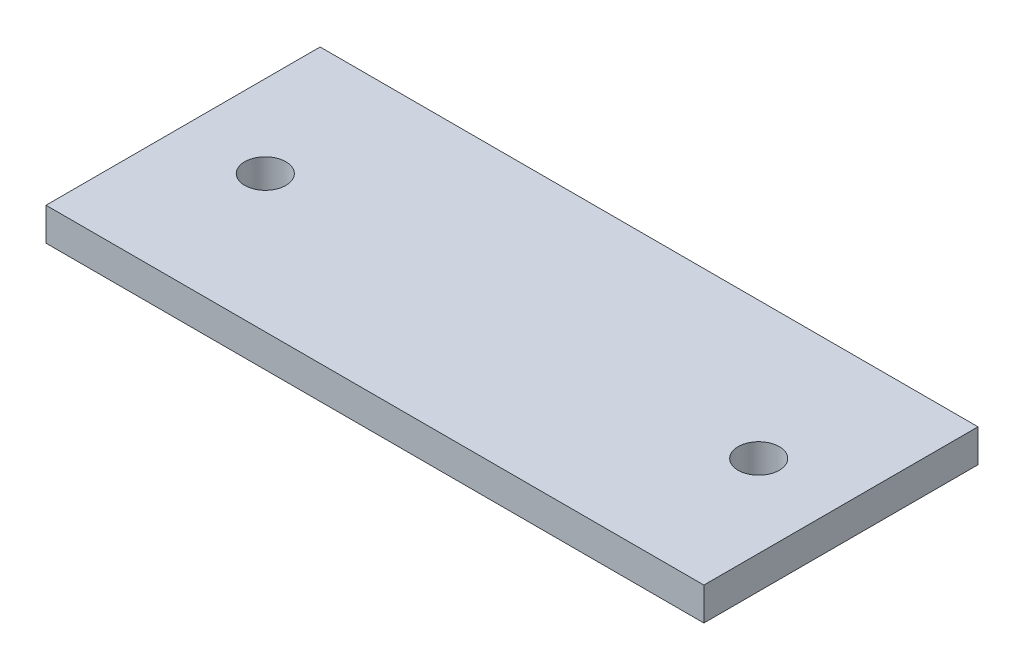
ISO-10303-21;
HEADER;
FILE_DESCRIPTION(('STEP AP214'),'2;1');
FILE_NAME('part.step','',(''),(''),'','','');
FILE_SCHEMA(('AUTOMOTIVE_DESIGN { 1 0 10303 214 1 1 1 1 }'));
ENDSEC;
DATA;
#1=APPLICATION_CONTEXT('core data for automotive mechanical design processes');
#2=APPLICATION_PROTOCOL_DEFINITION('international standard','automotive_design',2000,#1);
#3=PRODUCT_CONTEXT('',#1,'mechanical');
#4=PRODUCT('Part','Part','',(#3));
#5=PRODUCT_RELATED_PRODUCT_CATEGORY('part','',(#4));
#6=PRODUCT_DEFINITION_FORMATION('','',#4);
#7=PRODUCT_DEFINITION_CONTEXT('part definition',#1,'design');
#8=PRODUCT_DEFINITION('design','',#6,#7);
#9=PRODUCT_DEFINITION_SHAPE('','',#8);
#10=(LENGTH_UNIT() NAMED_UNIT(*) SI_UNIT(.MILLI.,.METRE.));
#11=(NAMED_UNIT(*) PLANE_ANGLE_UNIT() SI_UNIT($,.RADIAN.));
#12=(NAMED_UNIT(*) SI_UNIT($,.STERADIAN.) SOLID_ANGLE_UNIT());
#13=UNCERTAINTY_MEASURE_WITH_UNIT(LENGTH_MEASURE(1.E-05),#10,'distance_accuracy_value','');
#14=(GEOMETRIC_REPRESENTATION_CONTEXT(3) GLOBAL_UNCERTAINTY_ASSIGNED_CONTEXT((#13)) GLOBAL_UNIT_ASSIGNED_CONTEXT((#10,
#11,#12)) REPRESENTATION_CONTEXT('',''));
#15=CARTESIAN_POINT('',(0.,0.,0.));
#16=DIRECTION('',(0.,0.,1.));
#17=DIRECTION('',(1.,0.,0.));
#18=AXIS2_PLACEMENT_3D('',#15,#16,#17);
#19=CARTESIAN_POINT('',(0.,15.24,0.));
#20=DIRECTION('',(0.,1.,0.));
#21=DIRECTION('',(0.,0.,1.));
#22=AXIS2_PLACEMENT_3D('',#19,#20,#21);
#23=PLANE('',#22);
#24=CARTESIAN_POINT('',(38.1,15.24,63.5));
#25=DIRECTION('',(0.,1.,0.));
#26=DIRECTION('',(0.,0.,1.));
#27=AXIS2_PLACEMENT_3D('',#24,#25,#26);
#28=CIRCLE('',#27,9.525);
#29=CARTESIAN_POINT('',(38.1,15.24,53.975));
#30=VERTEX_POINT('',#29);
#31=EDGE_CURVE('E108',#30,#30,#28,.T.);
#32=ORIENTED_EDGE('',*,*,#31,.F.);
#33=EDGE_LOOP('',(#32));
#34=FACE_BOUND('',#33,.T.);
#35=DIRECTION('',(0.,0.,1.));
#36=VECTOR('',#35,1.);
#37=CARTESIAN_POINT('',(0.,15.24,0.));
#38=LINE('',#37,#36);
#39=CARTESIAN_POINT('',(0.,15.24,0.));
#40=VERTEX_POINT('',#39);
#41=CARTESIAN_POINT('',(0.,15.24,127.));
#42=VERTEX_POINT('',#41);
#43=EDGE_CURVE('E93',#40,#42,#38,.T.);
#44=ORIENTED_EDGE('',*,*,#43,.T.);
#45=DIRECTION('',(1.,0.,0.));
#46=VECTOR('',#45,1.);
#47=CARTESIAN_POINT('',(0.,15.24,127.));
#48=LINE('',#47,#46);
#49=CARTESIAN_POINT('',(304.8,15.24,127.));
#50=VERTEX_POINT('',#49);
#51=EDGE_CURVE('E88',#42,#50,#48,.T.);
#52=ORIENTED_EDGE('',*,*,#51,.T.);
#53=DIRECTION('',(0.,0.,-1.));
#54=VECTOR('',#53,1.);
#55=CARTESIAN_POINT('',(304.8,15.24,0.));
#56=LINE('',#55,#54);
#57=CARTESIAN_POINT('',(304.8,15.24,0.));
#58=VERTEX_POINT('',#57);
#59=EDGE_CURVE('E91',#50,#58,#56,.T.);
#60=ORIENTED_EDGE('',*,*,#59,.T.);
#61=DIRECTION('',(-1.,0.,0.));
#62=VECTOR('',#61,1.);
#63=CARTESIAN_POINT('',(0.,15.24,0.));
#64=LINE('',#63,#62);
#65=EDGE_CURVE('E58',#58,#40,#64,.T.);
#66=ORIENTED_EDGE('',*,*,#65,.T.);
#67=EDGE_LOOP('',(#44,#52,#60,#66));
#68=FACE_BOUND('',#67,.T.);
#69=CARTESIAN_POINT('',(266.7,15.24,63.5));
#70=DIRECTION('',(0.,1.,0.));
#71=DIRECTION('',(0.,0.,1.));
#72=AXIS2_PLACEMENT_3D('',#69,#70,#71);
#73=CIRCLE('',#72,9.52500000000002);
#74=CARTESIAN_POINT('',(266.7,15.24,53.975));
#75=VERTEX_POINT('',#74);
#76=EDGE_CURVE('E123',#75,#75,#73,.T.);
#77=ORIENTED_EDGE('',*,*,#76,.F.);
#78=EDGE_LOOP('',(#77));
#79=FACE_BOUND('',#78,.T.);
#80=ADVANCED_FACE('F41',(#34,#68,#79),#23,.T.);
#81=CARTESIAN_POINT('',(0.,0.,0.));
#82=DIRECTION('',(0.,1.,0.));
#83=DIRECTION('',(0.,0.,1.));
#84=AXIS2_PLACEMENT_3D('',#81,#82,#83);
#85=PLANE('',#84);
#86=DIRECTION('',(0.,0.,1.));
#87=VECTOR('',#86,1.);
#88=CARTESIAN_POINT('',(0.,0.,0.));
#89=LINE('',#88,#87);
#90=CARTESIAN_POINT('',(0.,0.,0.));
#91=VERTEX_POINT('',#90);
#92=CARTESIAN_POINT('',(0.,0.,127.));
#93=VERTEX_POINT('',#92);
#94=EDGE_CURVE('E105',#91,#93,#89,.T.);
#95=ORIENTED_EDGE('',*,*,#94,.F.);
#96=DIRECTION('',(-1.,0.,0.));
#97=VECTOR('',#96,1.);
#98=CARTESIAN_POINT('',(0.,0.,0.));
#99=LINE('',#98,#97);
#100=CARTESIAN_POINT('',(304.8,0.,0.));
#101=VERTEX_POINT('',#100);
#102=EDGE_CURVE('E81',#101,#91,#99,.T.);
#103=ORIENTED_EDGE('',*,*,#102,.F.);
#104=DIRECTION('',(0.,0.,-1.));
#105=VECTOR('',#104,1.);
#106=CARTESIAN_POINT('',(304.8,0.,0.));
#107=LINE('',#106,#105);
#108=CARTESIAN_POINT('',(304.8,0.,127.));
#109=VERTEX_POINT('',#108);
#110=EDGE_CURVE('E75',#109,#101,#107,.T.);
#111=ORIENTED_EDGE('',*,*,#110,.F.);
#112=DIRECTION('',(1.,0.,0.));
#113=VECTOR('',#112,1.);
#114=CARTESIAN_POINT('',(0.,0.,127.));
#115=LINE('',#114,#113);
#116=EDGE_CURVE('E97',#93,#109,#115,.T.);
#117=ORIENTED_EDGE('',*,*,#116,.F.);
#118=EDGE_LOOP('',(#95,#103,#111,#117));
#119=FACE_BOUND('',#118,.T.);
#120=CARTESIAN_POINT('',(38.1,0.,63.5));
#121=DIRECTION('',(0.,1.,0.));
#122=DIRECTION('',(0.,0.,1.));
#123=AXIS2_PLACEMENT_3D('',#120,#121,#122);
#124=CIRCLE('',#123,9.525);
#125=CARTESIAN_POINT('',(38.1,0.,53.975));
#126=VERTEX_POINT('',#125);
#127=EDGE_CURVE('E120',#126,#126,#124,.T.);
#128=ORIENTED_EDGE('',*,*,#127,.T.);
#129=EDGE_LOOP('',(#128));
#130=FACE_BOUND('',#129,.T.);
#131=CARTESIAN_POINT('',(266.7,0.,63.5));
#132=DIRECTION('',(0.,1.,0.));
#133=DIRECTION('',(0.,0.,1.));
#134=AXIS2_PLACEMENT_3D('',#131,#132,#133);
#135=CIRCLE('',#134,9.52500000000002);
#136=CARTESIAN_POINT('',(266.7,0.,53.975));
#137=VERTEX_POINT('',#136);
#138=EDGE_CURVE('E126',#137,#137,#135,.T.);
#139=ORIENTED_EDGE('',*,*,#138,.T.);
#140=EDGE_LOOP('',(#139));
#141=FACE_BOUND('',#140,.T.);
#142=ADVANCED_FACE('F116',(#119,#130,#141),#85,.F.);
#143=CARTESIAN_POINT('',(0.,15.24,0.));
#144=DIRECTION('',(1.,0.,0.));
#145=DIRECTION('',(0.,0.,-1.));
#146=AXIS2_PLACEMENT_3D('',#143,#144,#145);
#147=PLANE('',#146);
#148=ORIENTED_EDGE('',*,*,#94,.T.);
#149=DIRECTION('',(0.,-1.,0.));
#150=VECTOR('',#149,1.);
#151=CARTESIAN_POINT('',(0.,15.24,127.));
#152=LINE('',#151,#150);
#153=EDGE_CURVE('E11',#42,#93,#152,.T.);
#154=ORIENTED_EDGE('',*,*,#153,.F.);
#155=ORIENTED_EDGE('',*,*,#43,.F.);
#156=DIRECTION('',(0.,-1.,0.));
#157=VECTOR('',#156,1.);
#158=CARTESIAN_POINT('',(0.,15.24,0.));
#159=LINE('',#158,#157);
#160=EDGE_CURVE('E101',#40,#91,#159,.T.);
#161=ORIENTED_EDGE('',*,*,#160,.T.);
#162=EDGE_LOOP('',(#148,#154,#155,#161));
#163=FACE_BOUND('',#162,.T.);
#164=ADVANCED_FACE('F43',(#163),#147,.F.);
#165=CARTESIAN_POINT('',(0.,15.24,127.));
#166=DIRECTION('',(0.,0.,-1.));
#167=DIRECTION('',(-1.,0.,0.));
#168=AXIS2_PLACEMENT_3D('',#165,#166,#167);
#169=PLANE('',#168);
#170=ORIENTED_EDGE('',*,*,#116,.T.);
#171=DIRECTION('',(0.,-1.,0.));
#172=VECTOR('',#171,1.);
#173=CARTESIAN_POINT('',(304.8,15.24,127.));
#174=LINE('',#173,#172);
#175=EDGE_CURVE('E50',#50,#109,#174,.T.);
#176=ORIENTED_EDGE('',*,*,#175,.F.);
#177=ORIENTED_EDGE('',*,*,#51,.F.);
#178=ORIENTED_EDGE('',*,*,#153,.T.);
#179=EDGE_LOOP('',(#170,#176,#177,#178));
#180=FACE_BOUND('',#179,.T.);
#181=ADVANCED_FACE('F96',(#180),#169,.F.);
#182=CARTESIAN_POINT('',(304.8,15.24,0.));
#183=DIRECTION('',(-1.,0.,0.));
#184=DIRECTION('',(0.,0.,1.));
#185=AXIS2_PLACEMENT_3D('',#182,#183,#184);
#186=PLANE('',#185);
#187=ORIENTED_EDGE('',*,*,#110,.T.);
#188=DIRECTION('',(0.,-1.,0.));
#189=VECTOR('',#188,1.);
#190=CARTESIAN_POINT('',(304.8,15.24,0.));
#191=LINE('',#190,#189);
#192=EDGE_CURVE('E98',#58,#101,#191,.T.);
#193=ORIENTED_EDGE('',*,*,#192,.F.);
#194=ORIENTED_EDGE('',*,*,#59,.F.);
#195=ORIENTED_EDGE('',*,*,#175,.T.);
#196=EDGE_LOOP('',(#187,#193,#194,#195));
#197=FACE_BOUND('',#196,.T.);
#198=ADVANCED_FACE('F99',(#197),#186,.F.);
#199=CARTESIAN_POINT('',(0.,15.24,0.));
#200=DIRECTION('',(0.,0.,1.));
#201=DIRECTION('',(1.,0.,0.));
#202=AXIS2_PLACEMENT_3D('',#199,#200,#201);
#203=PLANE('',#202);
#204=ORIENTED_EDGE('',*,*,#102,.T.);
#205=ORIENTED_EDGE('',*,*,#160,.F.);
#206=ORIENTED_EDGE('',*,*,#65,.F.);
#207=ORIENTED_EDGE('',*,*,#192,.T.);
#208=EDGE_LOOP('',(#204,#205,#206,#207));
#209=FACE_BOUND('',#208,.T.);
#210=ADVANCED_FACE('F113',(#209),#203,.F.);
#211=CARTESIAN_POINT('',(38.1,15.24,63.5));
#212=DIRECTION('',(0.,-1.,0.));
#213=DIRECTION('',(0.,0.,-1.));
#214=AXIS2_PLACEMENT_3D('',#211,#212,#213);
#215=CYLINDRICAL_SURFACE('',#214,9.525);
#216=CARTESIAN_POINT('',(38.1,15.24,53.975));
#217=CARTESIAN_POINT('',(38.1,15.08125,53.975));
#218=CARTESIAN_POINT('',(38.1,14.9225,53.975));
#219=CARTESIAN_POINT('',(38.1,14.605,53.975));
#220=CARTESIAN_POINT('',(38.1,14.44625,53.975));
#221=CARTESIAN_POINT('',(38.1,14.12875,53.975));
#222=CARTESIAN_POINT('',(38.1,13.97,53.975));
#223=CARTESIAN_POINT('',(38.1,13.6525,53.975));
#224=CARTESIAN_POINT('',(38.1,13.49375,53.975));
#225=CARTESIAN_POINT('',(38.1,13.17625,53.975));
#226=CARTESIAN_POINT('',(38.1,13.0175,53.975));
#227=CARTESIAN_POINT('',(38.1,12.7,53.975));
#228=CARTESIAN_POINT('',(38.1,12.54125,53.975));
#229=CARTESIAN_POINT('',(38.1,12.22375,53.975));
#230=CARTESIAN_POINT('',(38.1,12.065,53.975));
#231=CARTESIAN_POINT('',(38.1,11.7475,53.975));
#232=CARTESIAN_POINT('',(38.1,11.58875,53.975));
#233=CARTESIAN_POINT('',(38.1,11.27125,53.975));
#234=CARTESIAN_POINT('',(38.1,11.1125,53.975));
#235=CARTESIAN_POINT('',(38.1,10.795,53.975));
#236=CARTESIAN_POINT('',(38.1,10.63625,53.975));
#237=CARTESIAN_POINT('',(38.1,10.31875,53.975));
#238=CARTESIAN_POINT('',(38.1,10.16,53.975));
#239=CARTESIAN_POINT('',(38.1,9.8425,53.975));
#240=CARTESIAN_POINT('',(38.1,9.68375,53.975));
#241=CARTESIAN_POINT('',(38.1,9.36625,53.975));
#242=CARTESIAN_POINT('',(38.1,9.2075,53.975));
#243=CARTESIAN_POINT('',(38.1,8.89,53.975));
#244=CARTESIAN_POINT('',(38.1,8.73125,53.975));
#245=CARTESIAN_POINT('',(38.1,8.41375,53.975));
#246=CARTESIAN_POINT('',(38.1,8.255,53.975));
#247=CARTESIAN_POINT('',(38.1,7.9375,53.975));
#248=CARTESIAN_POINT('',(38.1,7.77875,53.975));
#249=CARTESIAN_POINT('',(38.1,7.46125,53.975));
#250=CARTESIAN_POINT('',(38.1,7.3025,53.975));
#251=CARTESIAN_POINT('',(38.1,6.985,53.975));
#252=CARTESIAN_POINT('',(38.1,6.82625,53.975));
#253=CARTESIAN_POINT('',(38.1,6.50875,53.975));
#254=CARTESIAN_POINT('',(38.1,6.35,53.975));
#255=CARTESIAN_POINT('',(38.1,6.0325,53.975));
#256=CARTESIAN_POINT('',(38.1,5.87375,53.975));
#257=CARTESIAN_POINT('',(38.1,5.55625,53.975));
#258=CARTESIAN_POINT('',(38.1,5.3975,53.975));
#259=CARTESIAN_POINT('',(38.1,5.08,53.975));
#260=CARTESIAN_POINT('',(38.1,4.92125,53.975));
#261=CARTESIAN_POINT('',(38.1,4.60375,53.975));
#262=CARTESIAN_POINT('',(38.1,4.445,53.975));
#263=CARTESIAN_POINT('',(38.1,4.1275,53.975));
#264=CARTESIAN_POINT('',(38.1,3.96875,53.975));
#265=CARTESIAN_POINT('',(38.1,3.65125,53.975));
#266=CARTESIAN_POINT('',(38.1,3.4925,53.975));
#267=CARTESIAN_POINT('',(38.1,3.175,53.975));
#268=CARTESIAN_POINT('',(38.1,3.01625,53.975));
#269=CARTESIAN_POINT('',(38.1,2.69875,53.975));
#270=CARTESIAN_POINT('',(38.1,2.54,53.975));
#271=CARTESIAN_POINT('',(38.1,2.2225,53.975));
#272=CARTESIAN_POINT('',(38.1,2.06375,53.975));
#273=CARTESIAN_POINT('',(38.1,1.74625,53.975));
#274=CARTESIAN_POINT('',(38.1,1.5875,53.975));
#275=CARTESIAN_POINT('',(38.1,1.27,53.975));
#276=CARTESIAN_POINT('',(38.1,1.11125,53.975));
#277=CARTESIAN_POINT('',(38.1,0.79375,53.975));
#278=CARTESIAN_POINT('',(38.1,0.634999999999999,53.975));
#279=CARTESIAN_POINT('',(38.1,0.3175,53.975));
#280=CARTESIAN_POINT('',(38.1,0.15875,53.975));
#281=CARTESIAN_POINT('',(38.1,0.,53.975));
#282=B_SPLINE_CURVE_WITH_KNOTS('',3,(#216,#217,#218,#219,#220,#221,#222,#223,#224,#225,#226,
#227,#228,#229,#230,#231,#232,#233,#234,#235,#236,#237,#238,#239,#240,#241,#242,#243,#244,#245,
#246,#247,#248,#249,#250,#251,#252,#253,#254,#255,#256,#257,#258,#259,#260,#261,#262,#263,#264,
#265,#266,#267,#268,#269,#270,#271,#272,#273,#274,#275,#276,#277,#278,#279,#280,#281),
.UNSPECIFIED.,.F.,.F.,(4,2,2,2,2,2,2,2,2,2,2,2,2,2,2,2,2,2,2,2,2,2,2,2,2,2,2,2,2,2,2,2,4),(0.,
0.476249999999999,0.952499999999998,1.42875,1.905,2.38125,2.8575,3.33375,3.81,4.28625,4.7625,
5.23875,5.715,6.19125,6.6675,7.14375,7.62,8.09625,8.5725,9.04875,9.525,10.00125,10.4775,
10.95375,11.43,11.90625,12.3825,12.85875,13.335,13.81125,14.2875,14.76375,15.24),.UNSPECIFIED.);
#283=EDGE_CURVE('BSEAM143',#30,#126,#282,.T.);
#284=ORIENTED_EDGE('',*,*,#31,.T.);
#285=ORIENTED_EDGE('',*,*,#127,.F.);
#286=ORIENTED_EDGE('',*,*,#283,.T.);
#287=ORIENTED_EDGE('',*,*,#283,.F.);
#288=EDGE_LOOP('',(#284,#286,#285,#287));
#289=FACE_BOUND('',#288,.T.);
#290=ADVANCED_FACE('F143',(#289),#215,.F.);
#291=CARTESIAN_POINT('',(266.7,15.24,63.5));
#292=DIRECTION('',(0.,-1.,0.));
#293=DIRECTION('',(0.,0.,-1.));
#294=AXIS2_PLACEMENT_3D('',#291,#292,#293);
#295=CYLINDRICAL_SURFACE('',#294,9.52500000000002);
#296=CARTESIAN_POINT('',(266.7,15.24,53.975));
#297=CARTESIAN_POINT('',(266.7,15.08125,53.975));
#298=CARTESIAN_POINT('',(266.7,14.9225,53.975));
#299=CARTESIAN_POINT('',(266.7,14.605,53.975));
#300=CARTESIAN_POINT('',(266.7,14.44625,53.975));
#301=CARTESIAN_POINT('',(266.7,14.12875,53.975));
#302=CARTESIAN_POINT('',(266.7,13.97,53.975));
#303=CARTESIAN_POINT('',(266.7,13.6525,53.975));
#304=CARTESIAN_POINT('',(266.7,13.49375,53.975));
#305=CARTESIAN_POINT('',(266.7,13.17625,53.975));
#306=CARTESIAN_POINT('',(266.7,13.0175,53.975));
#307=CARTESIAN_POINT('',(266.7,12.7,53.975));
#308=CARTESIAN_POINT('',(266.7,12.54125,53.975));
#309=CARTESIAN_POINT('',(266.7,12.22375,53.975));
#310=CARTESIAN_POINT('',(266.7,12.065,53.975));
#311=CARTESIAN_POINT('',(266.7,11.7475,53.975));
#312=CARTESIAN_POINT('',(266.7,11.58875,53.975));
#313=CARTESIAN_POINT('',(266.7,11.27125,53.975));
#314=CARTESIAN_POINT('',(266.7,11.1125,53.975));
#315=CARTESIAN_POINT('',(266.7,10.795,53.975));
#316=CARTESIAN_POINT('',(266.7,10.63625,53.975));
#317=CARTESIAN_POINT('',(266.7,10.31875,53.975));
#318=CARTESIAN_POINT('',(266.7,10.16,53.975));
#319=CARTESIAN_POINT('',(266.7,9.8425,53.975));
#320=CARTESIAN_POINT('',(266.7,9.68375,53.975));
#321=CARTESIAN_POINT('',(266.7,9.36625,53.975));
#322=CARTESIAN_POINT('',(266.7,9.2075,53.975));
#323=CARTESIAN_POINT('',(266.7,8.89,53.975));
#324=CARTESIAN_POINT('',(266.7,8.73125,53.975));
#325=CARTESIAN_POINT('',(266.7,8.41375,53.975));
#326=CARTESIAN_POINT('',(266.7,8.255,53.975));
#327=CARTESIAN_POINT('',(266.7,7.9375,53.975));
#328=CARTESIAN_POINT('',(266.7,7.77875,53.975));
#329=CARTESIAN_POINT('',(266.7,7.46125,53.975));
#330=CARTESIAN_POINT('',(266.7,7.3025,53.975));
#331=CARTESIAN_POINT('',(266.7,6.985,53.975));
#332=CARTESIAN_POINT('',(266.7,6.82625,53.975));
#333=CARTESIAN_POINT('',(266.7,6.50875,53.975));
#334=CARTESIAN_POINT('',(266.7,6.35,53.975));
#335=CARTESIAN_POINT('',(266.7,6.0325,53.975));
#336=CARTESIAN_POINT('',(266.7,5.87375,53.975));
#337=CARTESIAN_POINT('',(266.7,5.55625,53.975));
#338=CARTESIAN_POINT('',(266.7,5.3975,53.975));
#339=CARTESIAN_POINT('',(266.7,5.08,53.975));
#340=CARTESIAN_POINT('',(266.7,4.92125,53.975));
#341=CARTESIAN_POINT('',(266.7,4.60375,53.975));
#342=CARTESIAN_POINT('',(266.7,4.445,53.975));
#343=CARTESIAN_POINT('',(266.7,4.1275,53.975));
#344=CARTESIAN_POINT('',(266.7,3.96875,53.975));
#345=CARTESIAN_POINT('',(266.7,3.65125,53.975));
#346=CARTESIAN_POINT('',(266.7,3.4925,53.975));
#347=CARTESIAN_POINT('',(266.7,3.175,53.975));
#348=CARTESIAN_POINT('',(266.7,3.01625,53.975));
#349=CARTESIAN_POINT('',(266.7,2.69875,53.975));
#350=CARTESIAN_POINT('',(266.7,2.54,53.975));
#351=CARTESIAN_POINT('',(266.7,2.2225,53.975));
#352=CARTESIAN_POINT('',(266.7,2.06375,53.975));
#353=CARTESIAN_POINT('',(266.7,1.74625,53.975));
#354=CARTESIAN_POINT('',(266.7,1.5875,53.975));
#355=CARTESIAN_POINT('',(266.7,1.27,53.975));
#356=CARTESIAN_POINT('',(266.7,1.11125,53.975));
#357=CARTESIAN_POINT('',(266.7,0.79375,53.975));
#358=CARTESIAN_POINT('',(266.7,0.634999999999999,53.975));
#359=CARTESIAN_POINT('',(266.7,0.3175,53.975));
#360=CARTESIAN_POINT('',(266.7,0.15875,53.975));
#361=CARTESIAN_POINT('',(266.7,0.,53.975));
#362=B_SPLINE_CURVE_WITH_KNOTS('',3,(#296,#297,#298,#299,#300,#301,#302,#303,#304,#305,#306,
#307,#308,#309,#310,#311,#312,#313,#314,#315,#316,#317,#318,#319,#320,#321,#322,#323,#324,#325,
#326,#327,#328,#329,#330,#331,#332,#333,#334,#335,#336,#337,#338,#339,#340,#341,#342,#343,#344,
#345,#346,#347,#348,#349,#350,#351,#352,#353,#354,#355,#356,#357,#358,#359,#360,#361),
.UNSPECIFIED.,.F.,.F.,(4,2,2,2,2,2,2,2,2,2,2,2,2,2,2,2,2,2,2,2,2,2,2,2,2,2,2,2,2,2,2,2,4),(0.,
0.476249999999999,0.952499999999998,1.42875,1.905,2.38125,2.8575,3.33375,3.81,4.28625,4.7625,
5.23875,5.715,6.19125,6.6675,7.14375,7.62,8.09625,8.5725,9.04875,9.525,10.00125,10.4775,
10.95375,11.43,11.90625,12.3825,12.85875,13.335,13.81125,14.2875,14.76375,15.24),.UNSPECIFIED.);
#363=EDGE_CURVE('BSEAM132',#75,#137,#362,.T.);
#364=ORIENTED_EDGE('',*,*,#76,.T.);
#365=ORIENTED_EDGE('',*,*,#138,.F.);
#366=ORIENTED_EDGE('',*,*,#363,.T.);
#367=ORIENTED_EDGE('',*,*,#363,.F.);
#368=EDGE_LOOP('',(#364,#366,#365,#367));
#369=FACE_BOUND('',#368,.T.);
#370=ADVANCED_FACE('F132',(#369),#295,.F.);
#371=CLOSED_SHELL('',(#80,#142,#164,#181,#198,#210,#290,#370));
#372=MANIFOLD_SOLID_BREP('B2',#371);
#373=ADVANCED_BREP_SHAPE_REPRESENTATION('',(#18,#372),#14);
#374=SHAPE_DEFINITION_REPRESENTATION(#9,#373);
ENDSEC;
END-ISO-10303-21;
